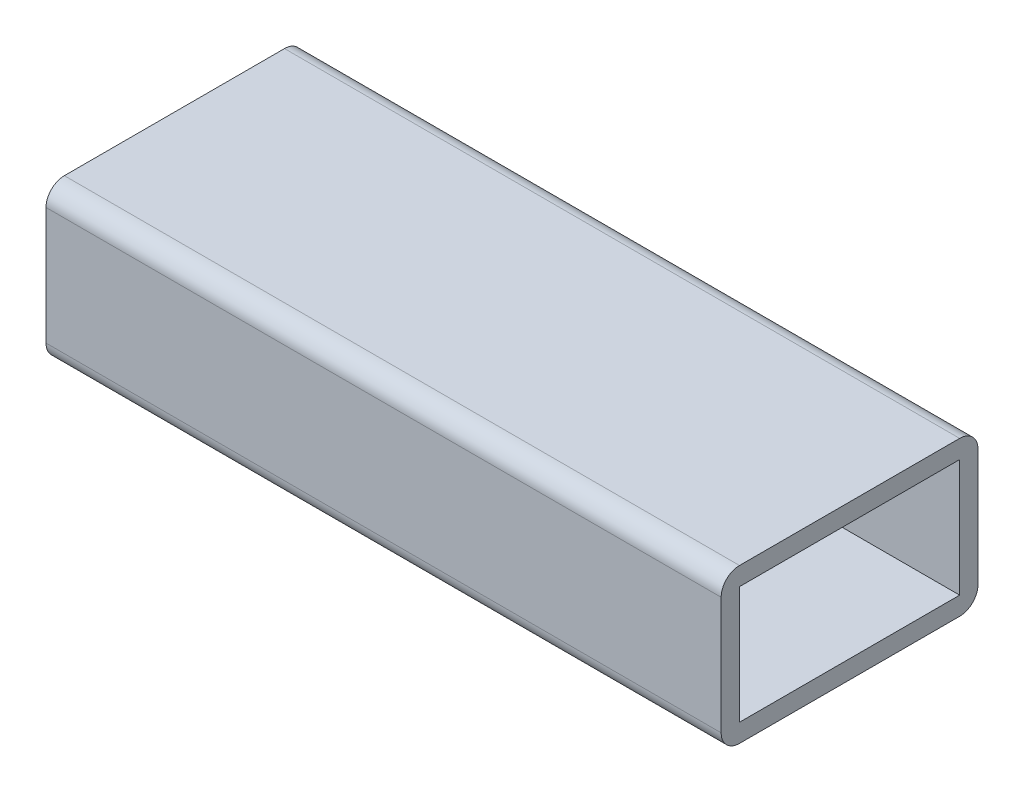
ISO-10303-21;
HEADER;
FILE_DESCRIPTION(('STEP AP214'),'2;1');
FILE_NAME('part.step','',(''),(''),'','','');
FILE_SCHEMA(('AUTOMOTIVE_DESIGN { 1 0 10303 214 1 1 1 1 }'));
ENDSEC;
DATA;
#1=APPLICATION_CONTEXT('core data for automotive mechanical design processes');
#2=APPLICATION_PROTOCOL_DEFINITION('international standard','automotive_design',2000,#1);
#3=PRODUCT_CONTEXT('',#1,'mechanical');
#4=PRODUCT('Part','Part','',(#3));
#5=PRODUCT_RELATED_PRODUCT_CATEGORY('part','',(#4));
#6=PRODUCT_DEFINITION_FORMATION('','',#4);
#7=PRODUCT_DEFINITION_CONTEXT('part definition',#1,'design');
#8=PRODUCT_DEFINITION('design','',#6,#7);
#9=PRODUCT_DEFINITION_SHAPE('','',#8);
#10=(LENGTH_UNIT() NAMED_UNIT(*) SI_UNIT(.MILLI.,.METRE.));
#11=(NAMED_UNIT(*) PLANE_ANGLE_UNIT() SI_UNIT($,.RADIAN.));
#12=(NAMED_UNIT(*) SI_UNIT($,.STERADIAN.) SOLID_ANGLE_UNIT());
#13=UNCERTAINTY_MEASURE_WITH_UNIT(LENGTH_MEASURE(1.E-05),#10,'distance_accuracy_value','');
#14=(GEOMETRIC_REPRESENTATION_CONTEXT(3) GLOBAL_UNCERTAINTY_ASSIGNED_CONTEXT((#13)) GLOBAL_UNIT_ASSIGNED_CONTEXT((#10,
#11,#12)) REPRESENTATION_CONTEXT('',''));
#15=CARTESIAN_POINT('',(0.,0.,0.));
#16=DIRECTION('',(0.,0.,1.));
#17=DIRECTION('',(1.,0.,0.));
#18=AXIS2_PLACEMENT_3D('',#15,#16,#17);
#19=CARTESIAN_POINT('',(9.2,0.,0.));
#20=DIRECTION('',(1.,0.,0.));
#21=DIRECTION('',(0.,0.,-1.));
#22=AXIS2_PLACEMENT_3D('',#19,#20,#21);
#23=PLANE('',#22);
#24=DIRECTION('',(0.,1.,0.));
#25=VECTOR('',#24,1.);
#26=CARTESIAN_POINT('',(9.2,-1.05,-1.75));
#27=LINE('',#26,#25);
#28=CARTESIAN_POINT('',(9.2,-0.8,-1.75));
#29=VERTEX_POINT('',#28);
#30=CARTESIAN_POINT('',(9.2,0.8,-1.75));
#31=VERTEX_POINT('',#30);
#32=EDGE_CURVE('E169',#29,#31,#27,.T.);
#33=ORIENTED_EDGE('',*,*,#32,.T.);
#34=CARTESIAN_POINT('',(9.2,0.8,-1.5));
#35=DIRECTION('',(1.,0.,0.));
#36=DIRECTION('',(0.,0.,-1.));
#37=AXIS2_PLACEMENT_3D('',#34,#35,#36);
#38=CIRCLE('',#37,0.25);
#39=CARTESIAN_POINT('',(9.2,1.05,-1.5));
#40=VERTEX_POINT('',#39);
#41=EDGE_CURVE('E209',#31,#40,#38,.T.);
#42=ORIENTED_EDGE('',*,*,#41,.T.);
#43=DIRECTION('',(0.,0.,1.));
#44=VECTOR('',#43,1.);
#45=CARTESIAN_POINT('',(9.2,1.05,1.75));
#46=LINE('',#45,#44);
#47=CARTESIAN_POINT('',(9.2,1.05,1.5));
#48=VERTEX_POINT('',#47);
#49=EDGE_CURVE('E173',#40,#48,#46,.T.);
#50=ORIENTED_EDGE('',*,*,#49,.T.);
#51=CARTESIAN_POINT('',(9.2,0.8,1.5));
#52=DIRECTION('',(1.,0.,0.));
#53=DIRECTION('',(0.,0.,-1.));
#54=AXIS2_PLACEMENT_3D('',#51,#52,#53);
#55=CIRCLE('',#54,0.25);
#56=CARTESIAN_POINT('',(9.2,0.8,1.75));
#57=VERTEX_POINT('',#56);
#58=EDGE_CURVE('E55',#48,#57,#55,.T.);
#59=ORIENTED_EDGE('',*,*,#58,.T.);
#60=DIRECTION('',(0.,-1.,0.));
#61=VECTOR('',#60,1.);
#62=CARTESIAN_POINT('',(9.2,-1.05,1.75));
#63=LINE('',#62,#61);
#64=CARTESIAN_POINT('',(9.2,-0.8,1.75));
#65=VERTEX_POINT('',#64);
#66=EDGE_CURVE('E175',#57,#65,#63,.T.);
#67=ORIENTED_EDGE('',*,*,#66,.T.);
#68=CARTESIAN_POINT('',(9.2,-0.8,1.5));
#69=DIRECTION('',(1.,0.,0.));
#70=DIRECTION('',(0.,0.,-1.));
#71=AXIS2_PLACEMENT_3D('',#68,#69,#70);
#72=CIRCLE('',#71,0.25);
#73=CARTESIAN_POINT('',(9.2,-1.05,1.5));
#74=VERTEX_POINT('',#73);
#75=EDGE_CURVE('E205',#65,#74,#72,.T.);
#76=ORIENTED_EDGE('',*,*,#75,.T.);
#77=DIRECTION('',(0.,0.,-1.));
#78=VECTOR('',#77,1.);
#79=CARTESIAN_POINT('',(9.2,-1.05,1.75));
#80=LINE('',#79,#78);
#81=CARTESIAN_POINT('',(9.2,-1.05,-1.5));
#82=VERTEX_POINT('',#81);
#83=EDGE_CURVE('E166',#74,#82,#80,.T.);
#84=ORIENTED_EDGE('',*,*,#83,.T.);
#85=CARTESIAN_POINT('',(9.2,-0.8,-1.5));
#86=DIRECTION('',(1.,0.,0.));
#87=DIRECTION('',(0.,0.,-1.));
#88=AXIS2_PLACEMENT_3D('',#85,#86,#87);
#89=CIRCLE('',#88,0.25);
#90=EDGE_CURVE('E207',#82,#29,#89,.T.);
#91=ORIENTED_EDGE('',*,*,#90,.T.);
#92=EDGE_LOOP('',(#33,#42,#50,#59,#67,#76,#84,#91));
#93=FACE_BOUND('',#92,.T.);
#94=DIRECTION('',(0.,0.,1.));
#95=VECTOR('',#94,1.);
#96=CARTESIAN_POINT('',(9.2,0.8,1.5));
#97=LINE('',#96,#95);
#98=CARTESIAN_POINT('',(9.2,0.8,-1.5));
#99=VERTEX_POINT('',#98);
#100=CARTESIAN_POINT('',(9.2,0.8,1.5));
#101=VERTEX_POINT('',#100);
#102=EDGE_CURVE('E135',#99,#101,#97,.T.);
#103=ORIENTED_EDGE('',*,*,#102,.F.);
#104=DIRECTION('',(0.,1.,0.));
#105=VECTOR('',#104,1.);
#106=CARTESIAN_POINT('',(9.2,-0.8,-1.5));
#107=LINE('',#106,#105);
#108=CARTESIAN_POINT('',(9.2,-0.8,-1.5));
#109=VERTEX_POINT('',#108);
#110=EDGE_CURVE('E125',#109,#99,#107,.T.);
#111=ORIENTED_EDGE('',*,*,#110,.F.);
#112=DIRECTION('',(0.,0.,-1.));
#113=VECTOR('',#112,1.);
#114=CARTESIAN_POINT('',(9.2,-0.8,1.5));
#115=LINE('',#114,#113);
#116=CARTESIAN_POINT('',(9.2,-0.8,1.5));
#117=VERTEX_POINT('',#116);
#118=EDGE_CURVE('E150',#117,#109,#115,.T.);
#119=ORIENTED_EDGE('',*,*,#118,.F.);
#120=DIRECTION('',(0.,-1.,0.));
#121=VECTOR('',#120,1.);
#122=CARTESIAN_POINT('',(9.2,-0.8,1.5));
#123=LINE('',#122,#121);
#124=EDGE_CURVE('E148',#101,#117,#123,.T.);
#125=ORIENTED_EDGE('',*,*,#124,.F.);
#126=EDGE_LOOP('',(#103,#111,#119,#125));
#127=FACE_BOUND('',#126,.T.);
#128=ADVANCED_FACE('F35',(#93,#127),#23,.T.);
#129=CARTESIAN_POINT('',(0.,0.,0.));
#130=DIRECTION('',(1.,0.,0.));
#131=DIRECTION('',(0.,0.,-1.));
#132=AXIS2_PLACEMENT_3D('',#129,#130,#131);
#133=PLANE('',#132);
#134=DIRECTION('',(0.,0.,1.));
#135=VECTOR('',#134,1.);
#136=CARTESIAN_POINT('',(0.,1.05,1.75));
#137=LINE('',#136,#135);
#138=CARTESIAN_POINT('',(0.,1.05,-1.5));
#139=VERTEX_POINT('',#138);
#140=CARTESIAN_POINT('',(0.,1.05,1.5));
#141=VERTEX_POINT('',#140);
#142=EDGE_CURVE('E183',#139,#141,#137,.T.);
#143=ORIENTED_EDGE('',*,*,#142,.F.);
#144=CARTESIAN_POINT('',(0.,0.8,-1.5));
#145=DIRECTION('',(1.,0.,0.));
#146=DIRECTION('',(0.,0.,-1.));
#147=AXIS2_PLACEMENT_3D('',#144,#145,#146);
#148=CIRCLE('',#147,0.25);
#149=CARTESIAN_POINT('',(0.,0.8,-1.75));
#150=VERTEX_POINT('',#149);
#151=EDGE_CURVE('E197',#139,#150,#148,.F.);
#152=ORIENTED_EDGE('',*,*,#151,.T.);
#153=DIRECTION('',(0.,1.,0.));
#154=VECTOR('',#153,1.);
#155=CARTESIAN_POINT('',(0.,-1.05,-1.75));
#156=LINE('',#155,#154);
#157=CARTESIAN_POINT('',(0.,-0.8,-1.75));
#158=VERTEX_POINT('',#157);
#159=EDGE_CURVE('E180',#158,#150,#156,.T.);
#160=ORIENTED_EDGE('',*,*,#159,.F.);
#161=CARTESIAN_POINT('',(0.,-0.8,-1.5));
#162=DIRECTION('',(1.,0.,0.));
#163=DIRECTION('',(0.,0.,-1.));
#164=AXIS2_PLACEMENT_3D('',#161,#162,#163);
#165=CIRCLE('',#164,0.25);
#166=CARTESIAN_POINT('',(0.,-1.05,-1.5));
#167=VERTEX_POINT('',#166);
#168=EDGE_CURVE('E195',#158,#167,#165,.F.);
#169=ORIENTED_EDGE('',*,*,#168,.T.);
#170=DIRECTION('',(0.,0.,-1.));
#171=VECTOR('',#170,1.);
#172=CARTESIAN_POINT('',(0.,-1.05,1.75));
#173=LINE('',#172,#171);
#174=CARTESIAN_POINT('',(0.,-1.05,1.5));
#175=VERTEX_POINT('',#174);
#176=EDGE_CURVE('E143',#175,#167,#173,.T.);
#177=ORIENTED_EDGE('',*,*,#176,.F.);
#178=CARTESIAN_POINT('',(0.,-0.8,1.5));
#179=DIRECTION('',(1.,0.,0.));
#180=DIRECTION('',(0.,0.,-1.));
#181=AXIS2_PLACEMENT_3D('',#178,#179,#180);
#182=CIRCLE('',#181,0.25);
#183=CARTESIAN_POINT('',(0.,-0.8,1.75));
#184=VERTEX_POINT('',#183);
#185=EDGE_CURVE('E193',#175,#184,#182,.F.);
#186=ORIENTED_EDGE('',*,*,#185,.T.);
#187=DIRECTION('',(0.,-1.,0.));
#188=VECTOR('',#187,1.);
#189=CARTESIAN_POINT('',(0.,-1.05,1.75));
#190=LINE('',#189,#188);
#191=CARTESIAN_POINT('',(0.,0.8,1.75));
#192=VERTEX_POINT('',#191);
#193=EDGE_CURVE('E170',#192,#184,#190,.T.);
#194=ORIENTED_EDGE('',*,*,#193,.F.);
#195=CARTESIAN_POINT('',(0.,0.8,1.5));
#196=DIRECTION('',(1.,0.,0.));
#197=DIRECTION('',(0.,0.,-1.));
#198=AXIS2_PLACEMENT_3D('',#195,#196,#197);
#199=CIRCLE('',#198,0.25);
#200=EDGE_CURVE('E191',#192,#141,#199,.F.);
#201=ORIENTED_EDGE('',*,*,#200,.T.);
#202=EDGE_LOOP('',(#143,#152,#160,#169,#177,#186,#194,#201));
#203=FACE_BOUND('',#202,.T.);
#204=DIRECTION('',(0.,1.,0.));
#205=VECTOR('',#204,1.);
#206=CARTESIAN_POINT('',(0.,-0.8,-1.5));
#207=LINE('',#206,#205);
#208=CARTESIAN_POINT('',(0.,-0.8,-1.5));
#209=VERTEX_POINT('',#208);
#210=CARTESIAN_POINT('',(0.,0.8,-1.5));
#211=VERTEX_POINT('',#210);
#212=EDGE_CURVE('E154',#209,#211,#207,.T.);
#213=ORIENTED_EDGE('',*,*,#212,.T.);
#214=DIRECTION('',(0.,0.,1.));
#215=VECTOR('',#214,1.);
#216=CARTESIAN_POINT('',(0.,0.8,1.5));
#217=LINE('',#216,#215);
#218=CARTESIAN_POINT('',(0.,0.8,1.5));
#219=VERTEX_POINT('',#218);
#220=EDGE_CURVE('E142',#211,#219,#217,.T.);
#221=ORIENTED_EDGE('',*,*,#220,.T.);
#222=DIRECTION('',(0.,-1.,0.));
#223=VECTOR('',#222,1.);
#224=CARTESIAN_POINT('',(0.,-0.8,1.5));
#225=LINE('',#224,#223);
#226=CARTESIAN_POINT('',(0.,-0.8,1.5));
#227=VERTEX_POINT('',#226);
#228=EDGE_CURVE('E157',#219,#227,#225,.T.);
#229=ORIENTED_EDGE('',*,*,#228,.T.);
#230=DIRECTION('',(0.,0.,-1.));
#231=VECTOR('',#230,1.);
#232=CARTESIAN_POINT('',(0.,-0.8,1.5));
#233=LINE('',#232,#231);
#234=EDGE_CURVE('E136',#227,#209,#233,.T.);
#235=ORIENTED_EDGE('',*,*,#234,.T.);
#236=EDGE_LOOP('',(#213,#221,#229,#235));
#237=FACE_BOUND('',#236,.T.);
#238=ADVANCED_FACE('F222',(#203,#237),#133,.F.);
#239=CARTESIAN_POINT('',(9.2,-1.05,1.75));
#240=DIRECTION('',(0.,1.,0.));
#241=DIRECTION('',(0.,0.,1.));
#242=AXIS2_PLACEMENT_3D('',#239,#240,#241);
#243=PLANE('',#242);
#244=ORIENTED_EDGE('',*,*,#176,.T.);
#245=DIRECTION('',(-1.,0.,0.));
#246=VECTOR('',#245,1.);
#247=CARTESIAN_POINT('',(9.2,-1.05,-1.5));
#248=LINE('',#247,#246);
#249=EDGE_CURVE('E214',#167,#82,#248,.F.);
#250=ORIENTED_EDGE('',*,*,#249,.T.);
#251=ORIENTED_EDGE('',*,*,#83,.F.);
#252=DIRECTION('',(-1.,0.,0.));
#253=VECTOR('',#252,1.);
#254=CARTESIAN_POINT('',(9.2,-1.05,1.5));
#255=LINE('',#254,#253);
#256=EDGE_CURVE('E211',#74,#175,#255,.T.);
#257=ORIENTED_EDGE('',*,*,#256,.T.);
#258=EDGE_LOOP('',(#244,#250,#251,#257));
#259=FACE_BOUND('',#258,.T.);
#260=ADVANCED_FACE('F231',(#259),#243,.F.);
#261=CARTESIAN_POINT('',(9.2,-1.05,-1.75));
#262=DIRECTION('',(0.,0.,1.));
#263=DIRECTION('',(1.,0.,0.));
#264=AXIS2_PLACEMENT_3D('',#261,#262,#263);
#265=PLANE('',#264);
#266=ORIENTED_EDGE('',*,*,#159,.T.);
#267=DIRECTION('',(-1.,0.,0.));
#268=VECTOR('',#267,1.);
#269=CARTESIAN_POINT('',(9.2,0.8,-1.75));
#270=LINE('',#269,#268);
#271=EDGE_CURVE('E202',#150,#31,#270,.F.);
#272=ORIENTED_EDGE('',*,*,#271,.T.);
#273=ORIENTED_EDGE('',*,*,#32,.F.);
#274=DIRECTION('',(-1.,0.,0.));
#275=VECTOR('',#274,1.);
#276=CARTESIAN_POINT('',(9.2,-0.8,-1.75));
#277=LINE('',#276,#275);
#278=EDGE_CURVE('E199',#29,#158,#277,.T.);
#279=ORIENTED_EDGE('',*,*,#278,.T.);
#280=EDGE_LOOP('',(#266,#272,#273,#279));
#281=FACE_BOUND('',#280,.T.);
#282=ADVANCED_FACE('F240',(#281),#265,.F.);
#283=CARTESIAN_POINT('',(9.2,1.05,1.75));
#284=DIRECTION('',(0.,-1.,0.));
#285=DIRECTION('',(0.,0.,-1.));
#286=AXIS2_PLACEMENT_3D('',#283,#284,#285);
#287=PLANE('',#286);
#288=ORIENTED_EDGE('',*,*,#49,.F.);
#289=DIRECTION('',(-1.,0.,0.));
#290=VECTOR('',#289,1.);
#291=CARTESIAN_POINT('',(9.2,1.05,-1.5));
#292=LINE('',#291,#290);
#293=EDGE_CURVE('E188',#40,#139,#292,.T.);
#294=ORIENTED_EDGE('',*,*,#293,.T.);
#295=ORIENTED_EDGE('',*,*,#142,.T.);
#296=DIRECTION('',(-1.,0.,0.));
#297=VECTOR('',#296,1.);
#298=CARTESIAN_POINT('',(9.2,1.05,1.5));
#299=LINE('',#298,#297);
#300=EDGE_CURVE('E177',#141,#48,#299,.F.);
#301=ORIENTED_EDGE('',*,*,#300,.T.);
#302=EDGE_LOOP('',(#288,#294,#295,#301));
#303=FACE_BOUND('',#302,.T.);
#304=ADVANCED_FACE('F248',(#303),#287,.F.);
#305=CARTESIAN_POINT('',(9.2,-1.05,1.75));
#306=DIRECTION('',(0.,0.,-1.));
#307=DIRECTION('',(-1.,0.,0.));
#308=AXIS2_PLACEMENT_3D('',#305,#306,#307);
#309=PLANE('',#308);
#310=ORIENTED_EDGE('',*,*,#193,.T.);
#311=DIRECTION('',(-1.,0.,0.));
#312=VECTOR('',#311,1.);
#313=CARTESIAN_POINT('',(9.2,-0.8,1.75));
#314=LINE('',#313,#312);
#315=EDGE_CURVE('E11',#184,#65,#314,.F.);
#316=ORIENTED_EDGE('',*,*,#315,.T.);
#317=ORIENTED_EDGE('',*,*,#66,.F.);
#318=DIRECTION('',(-1.,0.,0.));
#319=VECTOR('',#318,1.);
#320=CARTESIAN_POINT('',(9.2,0.8,1.75));
#321=LINE('',#320,#319);
#322=EDGE_CURVE('E43',#57,#192,#321,.T.);
#323=ORIENTED_EDGE('',*,*,#322,.T.);
#324=EDGE_LOOP('',(#310,#316,#317,#323));
#325=FACE_BOUND('',#324,.T.);
#326=ADVANCED_FACE('F218',(#325),#309,.F.);
#327=CARTESIAN_POINT('',(9.2,-0.8,-1.5));
#328=DIRECTION('',(0.,0.,1.));
#329=DIRECTION('',(1.,0.,0.));
#330=AXIS2_PLACEMENT_3D('',#327,#328,#329);
#331=PLANE('',#330);
#332=ORIENTED_EDGE('',*,*,#212,.F.);
#333=DIRECTION('',(-1.,0.,0.));
#334=VECTOR('',#333,1.);
#335=CARTESIAN_POINT('',(9.2,-0.8,-1.5));
#336=LINE('',#335,#334);
#337=EDGE_CURVE('E131',#109,#209,#336,.T.);
#338=ORIENTED_EDGE('',*,*,#337,.F.);
#339=ORIENTED_EDGE('',*,*,#110,.T.);
#340=DIRECTION('',(-1.,0.,0.));
#341=VECTOR('',#340,1.);
#342=CARTESIAN_POINT('',(9.2,0.8,-1.5));
#343=LINE('',#342,#341);
#344=EDGE_CURVE('E128',#99,#211,#343,.T.);
#345=ORIENTED_EDGE('',*,*,#344,.T.);
#346=EDGE_LOOP('',(#332,#338,#339,#345));
#347=FACE_BOUND('',#346,.T.);
#348=ADVANCED_FACE('F127',(#347),#331,.T.);
#349=CARTESIAN_POINT('',(9.2,0.8,1.5));
#350=DIRECTION('',(0.,-1.,0.));
#351=DIRECTION('',(0.,0.,-1.));
#352=AXIS2_PLACEMENT_3D('',#349,#350,#351);
#353=PLANE('',#352);
#354=ORIENTED_EDGE('',*,*,#220,.F.);
#355=ORIENTED_EDGE('',*,*,#344,.F.);
#356=ORIENTED_EDGE('',*,*,#102,.T.);
#357=DIRECTION('',(-1.,0.,0.));
#358=VECTOR('',#357,1.);
#359=CARTESIAN_POINT('',(9.2,0.8,1.5));
#360=LINE('',#359,#358);
#361=EDGE_CURVE('E144',#101,#219,#360,.T.);
#362=ORIENTED_EDGE('',*,*,#361,.T.);
#363=EDGE_LOOP('',(#354,#355,#356,#362));
#364=FACE_BOUND('',#363,.T.);
#365=ADVANCED_FACE('F139',(#364),#353,.T.);
#366=CARTESIAN_POINT('',(9.2,-0.8,1.5));
#367=DIRECTION('',(0.,0.,-1.));
#368=DIRECTION('',(-1.,0.,0.));
#369=AXIS2_PLACEMENT_3D('',#366,#367,#368);
#370=PLANE('',#369);
#371=ORIENTED_EDGE('',*,*,#228,.F.);
#372=ORIENTED_EDGE('',*,*,#361,.F.);
#373=ORIENTED_EDGE('',*,*,#124,.T.);
#374=DIRECTION('',(-1.,0.,0.));
#375=VECTOR('',#374,1.);
#376=CARTESIAN_POINT('',(9.2,-0.8,1.5));
#377=LINE('',#376,#375);
#378=EDGE_CURVE('E163',#117,#227,#377,.T.);
#379=ORIENTED_EDGE('',*,*,#378,.T.);
#380=EDGE_LOOP('',(#371,#372,#373,#379));
#381=FACE_BOUND('',#380,.T.);
#382=ADVANCED_FACE('F304',(#381),#370,.T.);
#383=CARTESIAN_POINT('',(9.2,-0.8,1.5));
#384=DIRECTION('',(0.,1.,0.));
#385=DIRECTION('',(0.,0.,1.));
#386=AXIS2_PLACEMENT_3D('',#383,#384,#385);
#387=PLANE('',#386);
#388=ORIENTED_EDGE('',*,*,#234,.F.);
#389=ORIENTED_EDGE('',*,*,#378,.F.);
#390=ORIENTED_EDGE('',*,*,#118,.T.);
#391=ORIENTED_EDGE('',*,*,#337,.T.);
#392=EDGE_LOOP('',(#388,#389,#390,#391));
#393=FACE_BOUND('',#392,.T.);
#394=ADVANCED_FACE('F273',(#393),#387,.T.);
#395=CARTESIAN_POINT('',(9.2,0.8,-1.5));
#396=DIRECTION('',(-1.,0.,0.));
#397=DIRECTION('',(0.,0.,1.));
#398=AXIS2_PLACEMENT_3D('',#395,#396,#397);
#399=CYLINDRICAL_SURFACE('',#398,0.25);
#400=ORIENTED_EDGE('',*,*,#41,.F.);
#401=ORIENTED_EDGE('',*,*,#271,.F.);
#402=ORIENTED_EDGE('',*,*,#151,.F.);
#403=ORIENTED_EDGE('',*,*,#293,.F.);
#404=EDGE_LOOP('',(#400,#401,#402,#403));
#405=FACE_BOUND('',#404,.T.);
#406=ADVANCED_FACE('F245',(#405),#399,.T.);
#407=CARTESIAN_POINT('',(9.2,-0.8,-1.5));
#408=DIRECTION('',(-1.,0.,0.));
#409=DIRECTION('',(0.,0.,1.));
#410=AXIS2_PLACEMENT_3D('',#407,#408,#409);
#411=CYLINDRICAL_SURFACE('',#410,0.25);
#412=ORIENTED_EDGE('',*,*,#90,.F.);
#413=ORIENTED_EDGE('',*,*,#249,.F.);
#414=ORIENTED_EDGE('',*,*,#168,.F.);
#415=ORIENTED_EDGE('',*,*,#278,.F.);
#416=EDGE_LOOP('',(#412,#413,#414,#415));
#417=FACE_BOUND('',#416,.T.);
#418=ADVANCED_FACE('F237',(#417),#411,.T.);
#419=CARTESIAN_POINT('',(9.2,-0.8,1.5));
#420=DIRECTION('',(-1.,0.,0.));
#421=DIRECTION('',(0.,0.,1.));
#422=AXIS2_PLACEMENT_3D('',#419,#420,#421);
#423=CYLINDRICAL_SURFACE('',#422,0.25);
#424=ORIENTED_EDGE('',*,*,#75,.F.);
#425=ORIENTED_EDGE('',*,*,#315,.F.);
#426=ORIENTED_EDGE('',*,*,#185,.F.);
#427=ORIENTED_EDGE('',*,*,#256,.F.);
#428=EDGE_LOOP('',(#424,#425,#426,#427));
#429=FACE_BOUND('',#428,.T.);
#430=ADVANCED_FACE('F228',(#429),#423,.T.);
#431=CARTESIAN_POINT('',(9.2,0.8,1.5));
#432=DIRECTION('',(-1.,0.,0.));
#433=DIRECTION('',(0.,0.,1.));
#434=AXIS2_PLACEMENT_3D('',#431,#432,#433);
#435=CYLINDRICAL_SURFACE('',#434,0.25);
#436=ORIENTED_EDGE('',*,*,#58,.F.);
#437=ORIENTED_EDGE('',*,*,#300,.F.);
#438=ORIENTED_EDGE('',*,*,#200,.F.);
#439=ORIENTED_EDGE('',*,*,#322,.F.);
#440=EDGE_LOOP('',(#436,#437,#438,#439));
#441=FACE_BOUND('',#440,.T.);
#442=ADVANCED_FACE('F37',(#441),#435,.T.);
#443=CLOSED_SHELL('',(#128,#238,#260,#282,#304,#326,#348,#365,#382,#394,#406,#418,#430,#442));
#444=MANIFOLD_SOLID_BREP('B2',#443);
#445=ADVANCED_BREP_SHAPE_REPRESENTATION('',(#18,#444),#14);
#446=SHAPE_DEFINITION_REPRESENTATION(#9,#445);
ENDSEC;
END-ISO-10303-21;
